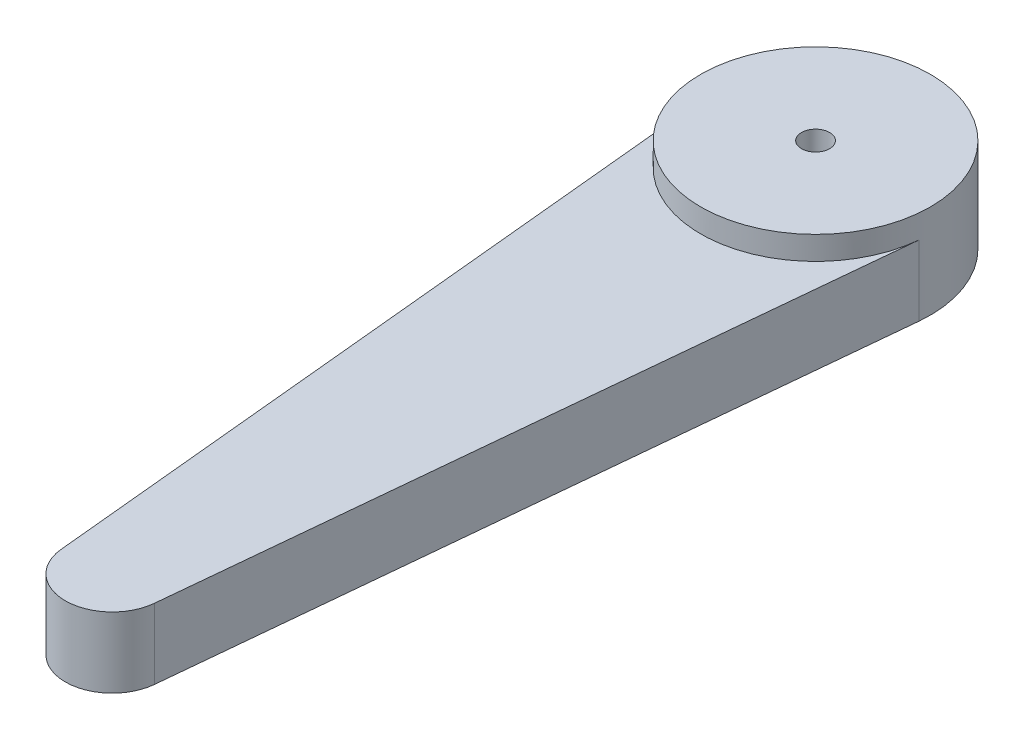
ISO-10303-21;
HEADER;
FILE_DESCRIPTION(('STEP AP214'),'2;1');
FILE_NAME('part.step','',(''),(''),'','','');
FILE_SCHEMA(('AUTOMOTIVE_DESIGN { 1 0 10303 214 1 1 1 1 }'));
ENDSEC;
DATA;
#1=APPLICATION_CONTEXT('core data for automotive mechanical design processes');
#2=APPLICATION_PROTOCOL_DEFINITION('international standard','automotive_design',2000,#1);
#3=PRODUCT_CONTEXT('',#1,'mechanical');
#4=PRODUCT('Part','Part','',(#3));
#5=PRODUCT_RELATED_PRODUCT_CATEGORY('part','',(#4));
#6=PRODUCT_DEFINITION_FORMATION('','',#4);
#7=PRODUCT_DEFINITION_CONTEXT('part definition',#1,'design');
#8=PRODUCT_DEFINITION('design','',#6,#7);
#9=PRODUCT_DEFINITION_SHAPE('','',#8);
#10=(LENGTH_UNIT() NAMED_UNIT(*) SI_UNIT(.MILLI.,.METRE.));
#11=(NAMED_UNIT(*) PLANE_ANGLE_UNIT() SI_UNIT($,.RADIAN.));
#12=(NAMED_UNIT(*) SI_UNIT($,.STERADIAN.) SOLID_ANGLE_UNIT());
#13=UNCERTAINTY_MEASURE_WITH_UNIT(LENGTH_MEASURE(1.E-05),#10,'distance_accuracy_value','');
#14=(GEOMETRIC_REPRESENTATION_CONTEXT(3) GLOBAL_UNCERTAINTY_ASSIGNED_CONTEXT((#13)) GLOBAL_UNIT_ASSIGNED_CONTEXT((#10,
#11,#12)) REPRESENTATION_CONTEXT('',''));
#15=CARTESIAN_POINT('',(0.,0.,0.));
#16=DIRECTION('',(0.,0.,1.));
#17=DIRECTION('',(1.,0.,0.));
#18=AXIS2_PLACEMENT_3D('',#15,#16,#17);
#19=CARTESIAN_POINT('',(0.,20.,0.));
#20=DIRECTION('',(0.,-1.,0.));
#21=DIRECTION('',(0.,0.,-1.));
#22=AXIS2_PLACEMENT_3D('',#19,#20,#21);
#23=CYLINDRICAL_SURFACE('',#22,3.);
#24=CARTESIAN_POINT('',(0.,20.,0.));
#25=DIRECTION('',(0.,1.,0.));
#26=DIRECTION('',(0.,0.,1.));
#27=AXIS2_PLACEMENT_3D('',#24,#25,#26);
#28=CIRCLE('',#27,3.);
#29=CARTESIAN_POINT('',(0.,20.,3.));
#30=VERTEX_POINT('',#29);
#31=EDGE_CURVE('E112',#30,#30,#28,.T.);
#32=ORIENTED_EDGE('',*,*,#31,.T.);
#33=EDGE_LOOP('',(#32));
#34=FACE_BOUND('',#33,.T.);
#35=CARTESIAN_POINT('',(0.,15.,0.));
#36=DIRECTION('',(0.,-1.,0.));
#37=DIRECTION('',(0.,0.,-1.));
#38=AXIS2_PLACEMENT_3D('',#35,#36,#37);
#39=CIRCLE('',#38,3.);
#40=CARTESIAN_POINT('',(0.,15.,-3.));
#41=VERTEX_POINT('',#40);
#42=EDGE_CURVE('E39',#41,#41,#39,.T.);
#43=ORIENTED_EDGE('',*,*,#42,.T.);
#44=EDGE_LOOP('',(#43));
#45=FACE_BOUND('',#44,.T.);
#46=ADVANCED_FACE('F35',(#34,#45),#23,.F.);
#47=CARTESIAN_POINT('',(0.,20.,0.));
#48=DIRECTION('',(0.,1.,0.));
#49=DIRECTION('',(0.,0.,1.));
#50=AXIS2_PLACEMENT_3D('',#47,#48,#49);
#51=PLANE('',#50);
#52=CARTESIAN_POINT('',(0.,20.,0.));
#53=DIRECTION('',(0.,1.,0.));
#54=DIRECTION('',(0.,0.,1.));
#55=AXIS2_PLACEMENT_3D('',#52,#53,#54);
#56=CIRCLE('',#55,24.5);
#57=CARTESIAN_POINT('',(0.,20.,24.5));
#58=VERTEX_POINT('',#57);
#59=EDGE_CURVE('E11',#58,#58,#56,.T.);
#60=ORIENTED_EDGE('',*,*,#59,.T.);
#61=EDGE_LOOP('',(#60));
#62=FACE_BOUND('',#61,.T.);
#63=ORIENTED_EDGE('',*,*,#31,.F.);
#64=EDGE_LOOP('',(#63));
#65=FACE_BOUND('',#64,.T.);
#66=ADVANCED_FACE('F131',(#62,#65),#51,.T.);
#67=CARTESIAN_POINT('',(0.,0.,0.));
#68=DIRECTION('',(0.,1.,0.));
#69=DIRECTION('',(0.,0.,1.));
#70=AXIS2_PLACEMENT_3D('',#67,#68,#69);
#71=PLANE('',#70);
#72=CARTESIAN_POINT('',(0.,0.,0.));
#73=DIRECTION('',(0.,1.,0.));
#74=DIRECTION('',(0.,0.,1.));
#75=AXIS2_PLACEMENT_3D('',#72,#73,#74);
#76=CIRCLE('',#75,24.5);
#77=CARTESIAN_POINT('',(24.385261885455,0.,2.36833333333333));
#78=VERTEX_POINT('',#77);
#79=CARTESIAN_POINT('',(-24.385261885455,0.,2.36833333333333));
#80=VERTEX_POINT('',#79);
#81=EDGE_CURVE('E44',#78,#80,#76,.T.);
#82=ORIENTED_EDGE('',*,*,#81,.F.);
#83=DIRECTION('',(-0.0966666666666667,0.,0.995316811651223));
#84=VECTOR('',#83,1.);
#85=CARTESIAN_POINT('',(24.385261885455,0.,2.36833333333333));
#86=LINE('',#85,#84);
#87=CARTESIAN_POINT('',(9.95316811651223,0.,150.966666666667));
#88=VERTEX_POINT('',#87);
#89=EDGE_CURVE('E98',#78,#88,#86,.T.);
#90=ORIENTED_EDGE('',*,*,#89,.T.);
#91=CARTESIAN_POINT('',(0.,0.,150.));
#92=DIRECTION('',(0.,-1.,0.));
#93=DIRECTION('',(0.,0.,-1.));
#94=AXIS2_PLACEMENT_3D('',#91,#92,#93);
#95=CIRCLE('',#94,10.);
#96=CARTESIAN_POINT('',(-9.95316811651223,0.,150.966666666667));
#97=VERTEX_POINT('',#96);
#98=EDGE_CURVE('E104',#97,#88,#95,.F.);
#99=ORIENTED_EDGE('',*,*,#98,.F.);
#100=DIRECTION('',(0.0966666666666667,0.,0.995316811651223));
#101=VECTOR('',#100,1.);
#102=CARTESIAN_POINT('',(-24.385261885455,0.,2.36833333333333));
#103=LINE('',#102,#101);
#104=EDGE_CURVE('E90',#80,#97,#103,.T.);
#105=ORIENTED_EDGE('',*,*,#104,.F.);
#106=EDGE_LOOP('',(#82,#90,#99,#105));
#107=FACE_BOUND('',#106,.T.);
#108=ADVANCED_FACE('F117',(#107),#71,.F.);
#109=CARTESIAN_POINT('',(0.,20.,0.));
#110=DIRECTION('',(0.,-1.,0.));
#111=DIRECTION('',(0.,0.,-1.));
#112=AXIS2_PLACEMENT_3D('',#109,#110,#111);
#113=CYLINDRICAL_SURFACE('',#112,24.5);
#114=DIRECTION('',(0.,-1.,0.));
#115=VECTOR('',#114,1.);
#116=CARTESIAN_POINT('',(-24.385261885455,15.,2.36833333333333));
#117=LINE('',#116,#115);
#118=CARTESIAN_POINT('',(-24.385261885455,15.,2.36833333333333));
#119=VERTEX_POINT('',#118);
#120=EDGE_CURVE('E57',#119,#80,#117,.T.);
#121=ORIENTED_EDGE('',*,*,#120,.F.);
#122=CARTESIAN_POINT('',(0.,15.,0.));
#123=DIRECTION('',(0.,-1.,0.));
#124=DIRECTION('',(0.,0.,-1.));
#125=AXIS2_PLACEMENT_3D('',#122,#123,#124);
#126=CIRCLE('',#125,24.5);
#127=CARTESIAN_POINT('',(24.385261885455,15.,2.36833333333333));
#128=VERTEX_POINT('',#127);
#129=EDGE_CURVE('E52',#128,#119,#126,.T.);
#130=ORIENTED_EDGE('',*,*,#129,.F.);
#131=DIRECTION('',(0.,-1.,0.));
#132=VECTOR('',#131,1.);
#133=CARTESIAN_POINT('',(24.385261885455,15.,2.36833333333333));
#134=LINE('',#133,#132);
#135=EDGE_CURVE('E108',#128,#78,#134,.T.);
#136=ORIENTED_EDGE('',*,*,#135,.T.);
#137=ORIENTED_EDGE('',*,*,#81,.T.);
#138=EDGE_LOOP('',(#121,#130,#136,#137));
#139=FACE_BOUND('',#138,.T.);
#140=ORIENTED_EDGE('',*,*,#59,.F.);
#141=EDGE_LOOP('',(#140));
#142=FACE_BOUND('',#141,.T.);
#143=ADVANCED_FACE('F37',(#139,#142),#113,.T.);
#144=CARTESIAN_POINT('',(0.,15.,0.));
#145=DIRECTION('',(0.,-1.,0.));
#146=DIRECTION('',(0.,0.,-1.));
#147=AXIS2_PLACEMENT_3D('',#144,#145,#146);
#148=PLANE('',#147);
#149=ORIENTED_EDGE('',*,*,#42,.F.);
#150=EDGE_LOOP('',(#149));
#151=FACE_BOUND('',#150,.T.);
#152=ADVANCED_FACE('F127',(#151),#148,.F.);
#153=CARTESIAN_POINT('',(0.,15.,150.));
#154=DIRECTION('',(0.,-1.,0.));
#155=DIRECTION('',(0.,0.,-1.));
#156=AXIS2_PLACEMENT_3D('',#153,#154,#155);
#157=CYLINDRICAL_SURFACE('',#156,10.);
#158=ORIENTED_EDGE('',*,*,#98,.T.);
#159=DIRECTION('',(0.,-1.,0.));
#160=VECTOR('',#159,1.);
#161=CARTESIAN_POINT('',(9.95316811651223,15.,150.966666666667));
#162=LINE('',#161,#160);
#163=CARTESIAN_POINT('',(9.95316811651223,15.,150.966666666667));
#164=VERTEX_POINT('',#163);
#165=EDGE_CURVE('E96',#164,#88,#162,.T.);
#166=ORIENTED_EDGE('',*,*,#165,.F.);
#167=CARTESIAN_POINT('',(0.,15.,150.));
#168=DIRECTION('',(0.,-1.,0.));
#169=DIRECTION('',(0.,0.,-1.));
#170=AXIS2_PLACEMENT_3D('',#167,#168,#169);
#171=CIRCLE('',#170,10.);
#172=CARTESIAN_POINT('',(-9.95316811651223,15.,150.966666666667));
#173=VERTEX_POINT('',#172);
#174=EDGE_CURVE('E81',#173,#164,#171,.F.);
#175=ORIENTED_EDGE('',*,*,#174,.F.);
#176=DIRECTION('',(0.,-1.,0.));
#177=VECTOR('',#176,1.);
#178=CARTESIAN_POINT('',(-9.95316811651223,15.,150.966666666667));
#179=LINE('',#178,#177);
#180=EDGE_CURVE('E87',#173,#97,#179,.T.);
#181=ORIENTED_EDGE('',*,*,#180,.T.);
#182=EDGE_LOOP('',(#158,#166,#175,#181));
#183=FACE_BOUND('',#182,.T.);
#184=ADVANCED_FACE('F95',(#183),#157,.T.);
#185=CARTESIAN_POINT('',(24.385261885455,15.,2.36833333333333));
#186=DIRECTION('',(0.995316811651223,0.,0.0966666666666667));
#187=DIRECTION('',(0.0966666666666667,0.,-0.995316811651223));
#188=AXIS2_PLACEMENT_3D('',#185,#186,#187);
#189=PLANE('',#188);
#190=ORIENTED_EDGE('',*,*,#89,.F.);
#191=ORIENTED_EDGE('',*,*,#135,.F.);
#192=DIRECTION('',(-0.0966666666666667,0.,0.995316811651223));
#193=VECTOR('',#192,1.);
#194=CARTESIAN_POINT('',(24.385261885455,15.,2.36833333333333));
#195=LINE('',#194,#193);
#196=EDGE_CURVE('E84',#128,#164,#195,.T.);
#197=ORIENTED_EDGE('',*,*,#196,.T.);
#198=ORIENTED_EDGE('',*,*,#165,.T.);
#199=EDGE_LOOP('',(#190,#191,#197,#198));
#200=FACE_BOUND('',#199,.T.);
#201=ADVANCED_FACE('F119',(#200),#189,.T.);
#202=CARTESIAN_POINT('',(-24.385261885455,15.,2.36833333333333));
#203=DIRECTION('',(0.995316811651223,0.,-0.0966666666666667));
#204=DIRECTION('',(-0.0966666666666667,0.,-0.995316811651223));
#205=AXIS2_PLACEMENT_3D('',#202,#203,#204);
#206=PLANE('',#205);
#207=ORIENTED_EDGE('',*,*,#104,.T.);
#208=ORIENTED_EDGE('',*,*,#180,.F.);
#209=DIRECTION('',(0.0966666666666667,0.,0.995316811651223));
#210=VECTOR('',#209,1.);
#211=CARTESIAN_POINT('',(-24.385261885455,15.,2.36833333333333));
#212=LINE('',#211,#210);
#213=EDGE_CURVE('E76',#119,#173,#212,.T.);
#214=ORIENTED_EDGE('',*,*,#213,.F.);
#215=ORIENTED_EDGE('',*,*,#120,.T.);
#216=EDGE_LOOP('',(#207,#208,#214,#215));
#217=FACE_BOUND('',#216,.T.);
#218=ADVANCED_FACE('F88',(#217),#206,.F.);
#219=ORIENTED_EDGE('',*,*,#196,.F.);
#220=ORIENTED_EDGE('',*,*,#129,.T.);
#221=ORIENTED_EDGE('',*,*,#213,.T.);
#222=ORIENTED_EDGE('',*,*,#174,.T.);
#223=EDGE_LOOP('',(#219,#220,#221,#222));
#224=FACE_BOUND('',#223,.T.);
#225=ADVANCED_FACE('F79',(#224),#148,.F.);
#226=CLOSED_SHELL('',(#46,#66,#108,#143,#152,#184,#201,#218,#225));
#227=MANIFOLD_SOLID_BREP('B2',#226);
#228=ADVANCED_BREP_SHAPE_REPRESENTATION('',(#18,#227),#14);
#229=SHAPE_DEFINITION_REPRESENTATION(#9,#228);
ENDSEC;
END-ISO-10303-21;
